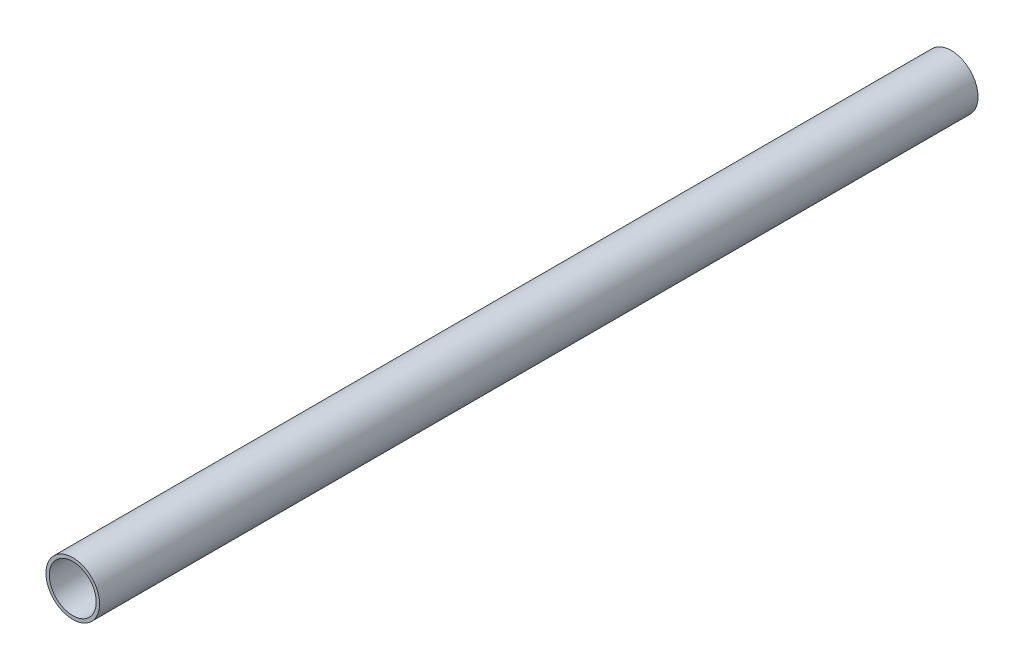
ISO-10303-21;
HEADER;
FILE_DESCRIPTION(('STEP AP214'),'2;1');
FILE_NAME('part.step','',(''),(''),'','','');
FILE_SCHEMA(('AUTOMOTIVE_DESIGN { 1 0 10303 214 1 1 1 1 }'));
ENDSEC;
DATA;
#1=APPLICATION_CONTEXT('core data for automotive mechanical design processes');
#2=APPLICATION_PROTOCOL_DEFINITION('international standard','automotive_design',2000,#1);
#3=PRODUCT_CONTEXT('',#1,'mechanical');
#4=PRODUCT('Part','Part','',(#3));
#5=PRODUCT_RELATED_PRODUCT_CATEGORY('part','',(#4));
#6=PRODUCT_DEFINITION_FORMATION('','',#4);
#7=PRODUCT_DEFINITION_CONTEXT('part definition',#1,'design');
#8=PRODUCT_DEFINITION('design','',#6,#7);
#9=PRODUCT_DEFINITION_SHAPE('','',#8);
#10=(LENGTH_UNIT() NAMED_UNIT(*) SI_UNIT(.MILLI.,.METRE.));
#11=(NAMED_UNIT(*) PLANE_ANGLE_UNIT() SI_UNIT($,.RADIAN.));
#12=(NAMED_UNIT(*) SI_UNIT($,.STERADIAN.) SOLID_ANGLE_UNIT());
#13=UNCERTAINTY_MEASURE_WITH_UNIT(LENGTH_MEASURE(1.E-05),#10,'distance_accuracy_value','');
#14=(GEOMETRIC_REPRESENTATION_CONTEXT(3) GLOBAL_UNCERTAINTY_ASSIGNED_CONTEXT((#13)) GLOBAL_UNIT_ASSIGNED_CONTEXT((#10,
#11,#12)) REPRESENTATION_CONTEXT('',''));
#15=CARTESIAN_POINT('',(0.,0.,0.));
#16=DIRECTION('',(0.,0.,1.));
#17=DIRECTION('',(1.,0.,0.));
#18=AXIS2_PLACEMENT_3D('',#15,#16,#17);
#19=CARTESIAN_POINT('',(0.,0.,262.));
#20=DIRECTION('',(0.,0.,1.));
#21=DIRECTION('',(1.,0.,0.));
#22=AXIS2_PLACEMENT_3D('',#19,#20,#21);
#23=PLANE('',#22);
#24=CARTESIAN_POINT('',(0.,0.,262.));
#25=DIRECTION('',(0.,0.,1.));
#26=DIRECTION('',(1.,0.,0.));
#27=AXIS2_PLACEMENT_3D('',#24,#25,#26);
#28=CIRCLE('',#27,7.);
#29=CARTESIAN_POINT('',(7.,0.,262.));
#30=VERTEX_POINT('',#29);
#31=EDGE_CURVE('E48',#30,#30,#28,.T.);
#32=ORIENTED_EDGE('',*,*,#31,.F.);
#33=EDGE_LOOP('',(#32));
#34=FACE_BOUND('',#33,.T.);
#35=CARTESIAN_POINT('',(0.,0.,262.));
#36=DIRECTION('',(0.,0.,1.));
#37=DIRECTION('',(1.,0.,0.));
#38=AXIS2_PLACEMENT_3D('',#35,#36,#37);
#39=CIRCLE('',#38,8.);
#40=CARTESIAN_POINT('',(8.,0.,262.));
#41=VERTEX_POINT('',#40);
#42=EDGE_CURVE('E11',#41,#41,#39,.T.);
#43=ORIENTED_EDGE('',*,*,#42,.T.);
#44=EDGE_LOOP('',(#43));
#45=FACE_BOUND('',#44,.T.);
#46=ADVANCED_FACE('F34',(#34,#45),#23,.T.);
#47=CARTESIAN_POINT('',(0.,0.,0.));
#48=DIRECTION('',(0.,0.,1.));
#49=DIRECTION('',(1.,0.,0.));
#50=AXIS2_PLACEMENT_3D('',#47,#48,#49);
#51=PLANE('',#50);
#52=CARTESIAN_POINT('',(0.,0.,0.));
#53=DIRECTION('',(0.,0.,1.));
#54=DIRECTION('',(1.,0.,0.));
#55=AXIS2_PLACEMENT_3D('',#52,#53,#54);
#56=CIRCLE('',#55,7.);
#57=CARTESIAN_POINT('',(7.,0.,0.));
#58=VERTEX_POINT('',#57);
#59=EDGE_CURVE('E38',#58,#58,#56,.T.);
#60=ORIENTED_EDGE('',*,*,#59,.T.);
#61=EDGE_LOOP('',(#60));
#62=FACE_BOUND('',#61,.T.);
#63=CARTESIAN_POINT('',(0.,0.,0.));
#64=DIRECTION('',(0.,0.,1.));
#65=DIRECTION('',(1.,0.,0.));
#66=AXIS2_PLACEMENT_3D('',#63,#64,#65);
#67=CIRCLE('',#66,8.);
#68=CARTESIAN_POINT('',(8.,0.,0.));
#69=VERTEX_POINT('',#68);
#70=EDGE_CURVE('E42',#69,#69,#67,.T.);
#71=ORIENTED_EDGE('',*,*,#70,.F.);
#72=EDGE_LOOP('',(#71));
#73=FACE_BOUND('',#72,.T.);
#74=ADVANCED_FACE('F68',(#62,#73),#51,.F.);
#75=CARTESIAN_POINT('',(0.,0.,0.));
#76=DIRECTION('',(0.,0.,1.));
#77=DIRECTION('',(1.,0.,0.));
#78=AXIS2_PLACEMENT_3D('',#75,#76,#77);
#79=CYLINDRICAL_SURFACE('',#78,8.);
#80=ORIENTED_EDGE('',*,*,#42,.F.);
#81=EDGE_LOOP('',(#80));
#82=FACE_BOUND('',#81,.T.);
#83=ORIENTED_EDGE('',*,*,#70,.T.);
#84=EDGE_LOOP('',(#83));
#85=FACE_BOUND('',#84,.T.);
#86=ADVANCED_FACE('F77',(#82,#85),#79,.T.);
#87=CARTESIAN_POINT('',(0.,0.,-0.153817756774157));
#88=DIRECTION('',(0.,0.,1.));
#89=DIRECTION('',(1.,0.,0.));
#90=AXIS2_PLACEMENT_3D('',#87,#88,#89);
#91=CYLINDRICAL_SURFACE('',#90,7.);
#92=ORIENTED_EDGE('',*,*,#31,.T.);
#93=EDGE_LOOP('',(#92));
#94=FACE_BOUND('',#93,.T.);
#95=ORIENTED_EDGE('',*,*,#59,.F.);
#96=EDGE_LOOP('',(#95));
#97=FACE_BOUND('',#96,.T.);
#98=ADVANCED_FACE('F79',(#94,#97),#91,.F.);
#99=CLOSED_SHELL('',(#46,#74,#86,#98));
#100=MANIFOLD_SOLID_BREP('B2',#99);
#101=ADVANCED_BREP_SHAPE_REPRESENTATION('',(#18,#100),#14);
#102=SHAPE_DEFINITION_REPRESENTATION(#9,#101);
ENDSEC;
END-ISO-10303-21;
